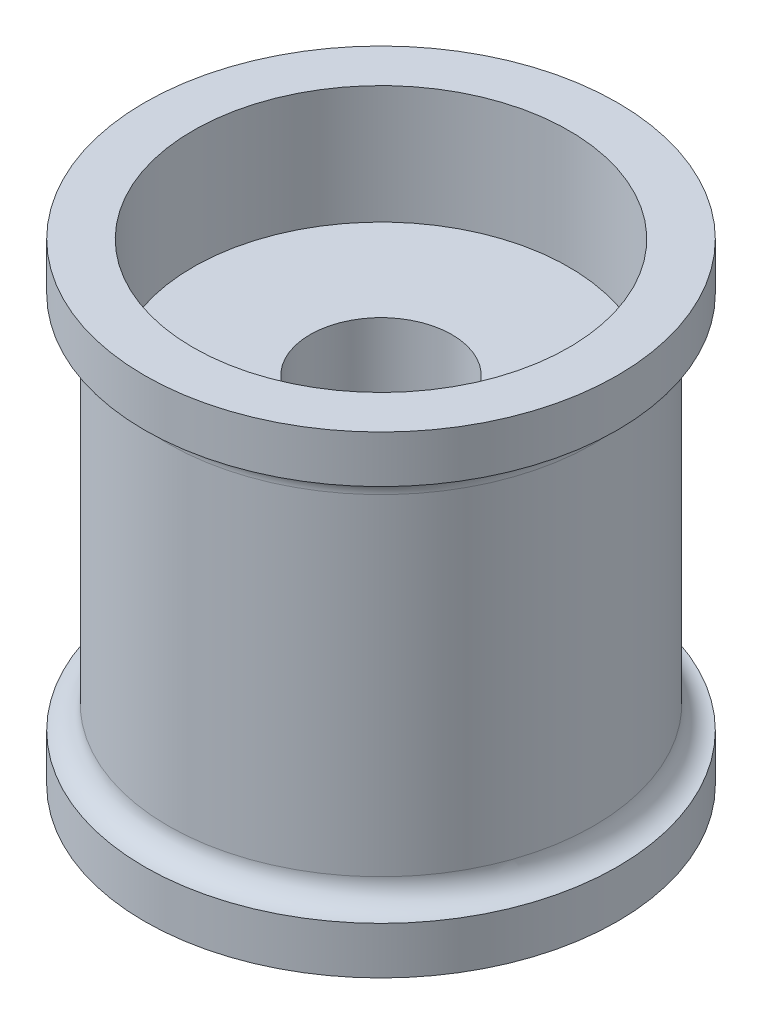
ISO-10303-21;
HEADER;
FILE_DESCRIPTION(('STEP AP214'),'2;1');
FILE_NAME('part.step','',(''),(''),'','','');
FILE_SCHEMA(('AUTOMOTIVE_DESIGN { 1 0 10303 214 1 1 1 1 }'));
ENDSEC;
DATA;
#1=APPLICATION_CONTEXT('core data for automotive mechanical design processes');
#2=APPLICATION_PROTOCOL_DEFINITION('international standard','automotive_design',2000,#1);
#3=PRODUCT_CONTEXT('',#1,'mechanical');
#4=PRODUCT('Part','Part','',(#3));
#5=PRODUCT_RELATED_PRODUCT_CATEGORY('part','',(#4));
#6=PRODUCT_DEFINITION_FORMATION('','',#4);
#7=PRODUCT_DEFINITION_CONTEXT('part definition',#1,'design');
#8=PRODUCT_DEFINITION('design','',#6,#7);
#9=PRODUCT_DEFINITION_SHAPE('','',#8);
#10=(LENGTH_UNIT() NAMED_UNIT(*) SI_UNIT(.MILLI.,.METRE.));
#11=(NAMED_UNIT(*) PLANE_ANGLE_UNIT() SI_UNIT($,.RADIAN.));
#12=(NAMED_UNIT(*) SI_UNIT($,.STERADIAN.) SOLID_ANGLE_UNIT());
#13=UNCERTAINTY_MEASURE_WITH_UNIT(LENGTH_MEASURE(1.E-05),#10,'distance_accuracy_value','');
#14=(GEOMETRIC_REPRESENTATION_CONTEXT(3) GLOBAL_UNCERTAINTY_ASSIGNED_CONTEXT((#13)) GLOBAL_UNIT_ASSIGNED_CONTEXT((#10,
#11,#12)) REPRESENTATION_CONTEXT('',''));
#15=CARTESIAN_POINT('',(0.,0.,0.));
#16=DIRECTION('',(0.,0.,1.));
#17=DIRECTION('',(1.,0.,0.));
#18=AXIS2_PLACEMENT_3D('',#15,#16,#17);
#19=CARTESIAN_POINT('',(0.,20.,0.));
#20=DIRECTION('',(0.,-1.,0.));
#21=DIRECTION('',(0.,0.,-1.));
#22=AXIS2_PLACEMENT_3D('',#19,#20,#21);
#23=CYLINDRICAL_SURFACE('',#22,3.);
#24=CARTESIAN_POINT('',(0.,5.,0.));
#25=DIRECTION('',(0.,-1.,0.));
#26=DIRECTION('',(0.,0.,-1.));
#27=AXIS2_PLACEMENT_3D('',#24,#25,#26);
#28=CIRCLE('',#27,3.);
#29=CARTESIAN_POINT('',(0.,5.,-3.));
#30=VERTEX_POINT('',#29);
#31=EDGE_CURVE('E61',#30,#30,#28,.T.);
#32=ORIENTED_EDGE('',*,*,#31,.T.);
#33=EDGE_LOOP('',(#32));
#34=FACE_BOUND('',#33,.T.);
#35=CARTESIAN_POINT('',(0.,15.,0.));
#36=DIRECTION('',(0.,1.,0.));
#37=DIRECTION('',(0.,0.,1.));
#38=AXIS2_PLACEMENT_3D('',#35,#36,#37);
#39=CIRCLE('',#38,3.);
#40=CARTESIAN_POINT('',(0.,15.,3.));
#41=VERTEX_POINT('',#40);
#42=EDGE_CURVE('E47',#41,#41,#39,.T.);
#43=ORIENTED_EDGE('',*,*,#42,.T.);
#44=EDGE_LOOP('',(#43));
#45=FACE_BOUND('',#44,.T.);
#46=ADVANCED_FACE('F43',(#34,#45),#23,.F.);
#47=CARTESIAN_POINT('',(0.,3.,0.));
#48=DIRECTION('',(0.,-1.,0.));
#49=DIRECTION('',(0.,0.,-1.));
#50=AXIS2_PLACEMENT_3D('',#47,#48,#49);
#51=TOROIDAL_SURFACE('',#50,10.,1.);
#52=CARTESIAN_POINT('',(0.,2.,0.));
#53=DIRECTION('',(0.,1.,0.));
#54=DIRECTION('',(0.,0.,1.));
#55=AXIS2_PLACEMENT_3D('',#52,#53,#54);
#56=CIRCLE('',#55,10.);
#57=CARTESIAN_POINT('',(0.,2.,10.));
#58=VERTEX_POINT('',#57);
#59=EDGE_CURVE('E71',#58,#58,#56,.T.);
#60=ORIENTED_EDGE('',*,*,#59,.T.);
#61=EDGE_LOOP('',(#60));
#62=FACE_BOUND('',#61,.T.);
#63=CARTESIAN_POINT('',(0.,3.,0.));
#64=DIRECTION('',(0.,-1.,0.));
#65=DIRECTION('',(0.,0.,-1.));
#66=AXIS2_PLACEMENT_3D('',#63,#64,#65);
#67=CIRCLE('',#66,9.);
#68=CARTESIAN_POINT('',(0.,3.,-9.));
#69=VERTEX_POINT('',#68);
#70=EDGE_CURVE('E10',#69,#69,#67,.F.);
#71=ORIENTED_EDGE('',*,*,#70,.F.);
#72=EDGE_LOOP('',(#71));
#73=FACE_BOUND('',#72,.T.);
#74=ADVANCED_FACE('F45',(#62,#73),#51,.F.);
#75=CARTESIAN_POINT('',(0.,17.,0.));
#76=DIRECTION('',(0.,1.,0.));
#77=DIRECTION('',(0.,0.,1.));
#78=AXIS2_PLACEMENT_3D('',#75,#76,#77);
#79=TOROIDAL_SURFACE('',#78,10.,1.);
#80=CARTESIAN_POINT('',(0.,18.,0.));
#81=DIRECTION('',(0.,1.,0.));
#82=DIRECTION('',(0.,0.,1.));
#83=AXIS2_PLACEMENT_3D('',#80,#81,#82);
#84=CIRCLE('',#83,10.);
#85=CARTESIAN_POINT('',(0.,18.,10.));
#86=VERTEX_POINT('',#85);
#87=EDGE_CURVE('E58',#86,#86,#84,.T.);
#88=ORIENTED_EDGE('',*,*,#87,.F.);
#89=EDGE_LOOP('',(#88));
#90=FACE_BOUND('',#89,.T.);
#91=CARTESIAN_POINT('',(0.,17.,0.));
#92=DIRECTION('',(0.,1.,0.));
#93=DIRECTION('',(0.,0.,1.));
#94=AXIS2_PLACEMENT_3D('',#91,#92,#93);
#95=CIRCLE('',#94,9.);
#96=CARTESIAN_POINT('',(0.,17.,9.));
#97=VERTEX_POINT('',#96);
#98=EDGE_CURVE('E52',#97,#97,#95,.F.);
#99=ORIENTED_EDGE('',*,*,#98,.F.);
#100=EDGE_LOOP('',(#99));
#101=FACE_BOUND('',#100,.T.);
#102=ADVANCED_FACE('F120',(#90,#101),#79,.F.);
#103=CARTESIAN_POINT('',(0.,0.,0.));
#104=DIRECTION('',(0.,1.,0.));
#105=DIRECTION('',(0.,0.,1.));
#106=AXIS2_PLACEMENT_3D('',#103,#104,#105);
#107=CYLINDRICAL_SURFACE('',#106,9.);
#108=ORIENTED_EDGE('',*,*,#70,.T.);
#109=EDGE_LOOP('',(#108));
#110=FACE_BOUND('',#109,.T.);
#111=ORIENTED_EDGE('',*,*,#98,.T.);
#112=EDGE_LOOP('',(#111));
#113=FACE_BOUND('',#112,.T.);
#114=ADVANCED_FACE('F124',(#110,#113),#107,.T.);
#115=CARTESIAN_POINT('',(0.,20.,0.));
#116=DIRECTION('',(0.,1.,0.));
#117=DIRECTION('',(0.,0.,1.));
#118=AXIS2_PLACEMENT_3D('',#115,#116,#117);
#119=PLANE('',#118);
#120=CARTESIAN_POINT('',(0.,20.,0.));
#121=DIRECTION('',(0.,1.,0.));
#122=DIRECTION('',(0.,0.,1.));
#123=AXIS2_PLACEMENT_3D('',#120,#121,#122);
#124=CIRCLE('',#123,7.95);
#125=CARTESIAN_POINT('',(0.,20.,7.95));
#126=VERTEX_POINT('',#125);
#127=EDGE_CURVE('E82',#126,#126,#124,.T.);
#128=ORIENTED_EDGE('',*,*,#127,.F.);
#129=EDGE_LOOP('',(#128));
#130=FACE_BOUND('',#129,.T.);
#131=CARTESIAN_POINT('',(0.,20.,0.));
#132=DIRECTION('',(0.,1.,0.));
#133=DIRECTION('',(0.,0.,1.));
#134=AXIS2_PLACEMENT_3D('',#131,#132,#133);
#135=CIRCLE('',#134,10.);
#136=CARTESIAN_POINT('',(0.,20.,10.));
#137=VERTEX_POINT('',#136);
#138=EDGE_CURVE('E87',#137,#137,#135,.T.);
#139=ORIENTED_EDGE('',*,*,#138,.T.);
#140=EDGE_LOOP('',(#139));
#141=FACE_BOUND('',#140,.T.);
#142=ADVANCED_FACE('F95',(#130,#141),#119,.T.);
#143=CARTESIAN_POINT('',(0.,0.,0.));
#144=DIRECTION('',(0.,1.,0.));
#145=DIRECTION('',(0.,0.,1.));
#146=AXIS2_PLACEMENT_3D('',#143,#144,#145);
#147=PLANE('',#146);
#148=CARTESIAN_POINT('',(0.,0.,0.));
#149=DIRECTION('',(0.,-1.,0.));
#150=DIRECTION('',(0.,0.,-1.));
#151=AXIS2_PLACEMENT_3D('',#148,#149,#150);
#152=CIRCLE('',#151,7.95);
#153=CARTESIAN_POINT('',(0.,0.,-7.95));
#154=VERTEX_POINT('',#153);
#155=EDGE_CURVE('E74',#154,#154,#152,.T.);
#156=ORIENTED_EDGE('',*,*,#155,.F.);
#157=EDGE_LOOP('',(#156));
#158=FACE_BOUND('',#157,.T.);
#159=CARTESIAN_POINT('',(0.,0.,0.));
#160=DIRECTION('',(0.,1.,0.));
#161=DIRECTION('',(0.,0.,1.));
#162=AXIS2_PLACEMENT_3D('',#159,#160,#161);
#163=CIRCLE('',#162,10.);
#164=CARTESIAN_POINT('',(0.,0.,10.));
#165=VERTEX_POINT('',#164);
#166=EDGE_CURVE('E64',#165,#165,#163,.T.);
#167=ORIENTED_EDGE('',*,*,#166,.F.);
#168=EDGE_LOOP('',(#167));
#169=FACE_BOUND('',#168,.T.);
#170=ADVANCED_FACE('F100',(#158,#169),#147,.F.);
#171=CARTESIAN_POINT('',(0.,18.,0.));
#172=DIRECTION('',(0.,1.,0.));
#173=DIRECTION('',(0.,0.,1.));
#174=AXIS2_PLACEMENT_3D('',#171,#172,#173);
#175=CYLINDRICAL_SURFACE('',#174,10.);
#176=ORIENTED_EDGE('',*,*,#87,.T.);
#177=EDGE_LOOP('',(#176));
#178=FACE_BOUND('',#177,.T.);
#179=ORIENTED_EDGE('',*,*,#138,.F.);
#180=EDGE_LOOP('',(#179));
#181=FACE_BOUND('',#180,.T.);
#182=ADVANCED_FACE('F97',(#178,#181),#175,.T.);
#183=CARTESIAN_POINT('',(0.,2.,0.));
#184=DIRECTION('',(0.,-1.,0.));
#185=DIRECTION('',(0.,0.,-1.));
#186=AXIS2_PLACEMENT_3D('',#183,#184,#185);
#187=CYLINDRICAL_SURFACE('',#186,10.);
#188=ORIENTED_EDGE('',*,*,#59,.F.);
#189=EDGE_LOOP('',(#188));
#190=FACE_BOUND('',#189,.T.);
#191=ORIENTED_EDGE('',*,*,#166,.T.);
#192=EDGE_LOOP('',(#191));
#193=FACE_BOUND('',#192,.T.);
#194=ADVANCED_FACE('F99',(#190,#193),#187,.T.);
#195=CARTESIAN_POINT('',(0.,5.,0.));
#196=DIRECTION('',(0.,-1.,0.));
#197=DIRECTION('',(0.,0.,-1.));
#198=AXIS2_PLACEMENT_3D('',#195,#196,#197);
#199=CYLINDRICAL_SURFACE('',#198,7.95);
#200=CARTESIAN_POINT('',(0.,5.,0.));
#201=DIRECTION('',(0.,-1.,0.));
#202=DIRECTION('',(0.,0.,-1.));
#203=AXIS2_PLACEMENT_3D('',#200,#201,#202);
#204=CIRCLE('',#203,7.95);
#205=CARTESIAN_POINT('',(0.,5.,-7.95));
#206=VERTEX_POINT('',#205);
#207=EDGE_CURVE('E65',#206,#206,#204,.T.);
#208=ORIENTED_EDGE('',*,*,#207,.F.);
#209=EDGE_LOOP('',(#208));
#210=FACE_BOUND('',#209,.T.);
#211=ORIENTED_EDGE('',*,*,#155,.T.);
#212=EDGE_LOOP('',(#211));
#213=FACE_BOUND('',#212,.T.);
#214=ADVANCED_FACE('F106',(#210,#213),#199,.F.);
#215=CARTESIAN_POINT('',(0.,5.,0.));
#216=DIRECTION('',(0.,-1.,0.));
#217=DIRECTION('',(0.,0.,-1.));
#218=AXIS2_PLACEMENT_3D('',#215,#216,#217);
#219=PLANE('',#218);
#220=ORIENTED_EDGE('',*,*,#31,.F.);
#221=EDGE_LOOP('',(#220));
#222=FACE_BOUND('',#221,.T.);
#223=ORIENTED_EDGE('',*,*,#207,.T.);
#224=EDGE_LOOP('',(#223));
#225=FACE_BOUND('',#224,.T.);
#226=ADVANCED_FACE('F151',(#222,#225),#219,.T.);
#227=CARTESIAN_POINT('',(0.,15.,0.));
#228=DIRECTION('',(0.,1.,0.));
#229=DIRECTION('',(0.,0.,1.));
#230=AXIS2_PLACEMENT_3D('',#227,#228,#229);
#231=CYLINDRICAL_SURFACE('',#230,7.95);
#232=CARTESIAN_POINT('',(0.,15.,0.));
#233=DIRECTION('',(0.,1.,0.));
#234=DIRECTION('',(0.,0.,1.));
#235=AXIS2_PLACEMENT_3D('',#232,#233,#234);
#236=CIRCLE('',#235,7.95);
#237=CARTESIAN_POINT('',(0.,15.,7.95));
#238=VERTEX_POINT('',#237);
#239=EDGE_CURVE('E194',#238,#238,#236,.T.);
#240=ORIENTED_EDGE('',*,*,#239,.F.);
#241=EDGE_LOOP('',(#240));
#242=FACE_BOUND('',#241,.T.);
#243=ORIENTED_EDGE('',*,*,#127,.T.);
#244=EDGE_LOOP('',(#243));
#245=FACE_BOUND('',#244,.T.);
#246=ADVANCED_FACE('F159',(#242,#245),#231,.F.);
#247=CARTESIAN_POINT('',(0.,15.,0.));
#248=DIRECTION('',(0.,1.,0.));
#249=DIRECTION('',(0.,0.,1.));
#250=AXIS2_PLACEMENT_3D('',#247,#248,#249);
#251=PLANE('',#250);
#252=ORIENTED_EDGE('',*,*,#42,.F.);
#253=EDGE_LOOP('',(#252));
#254=FACE_BOUND('',#253,.T.);
#255=ORIENTED_EDGE('',*,*,#239,.T.);
#256=EDGE_LOOP('',(#255));
#257=FACE_BOUND('',#256,.T.);
#258=ADVANCED_FACE('F176',(#254,#257),#251,.T.);
#259=CLOSED_SHELL('',(#46,#74,#102,#114,#142,#170,#182,#194,#214,#226,#246,#258));
#260=MANIFOLD_SOLID_BREP('B2',#259);
#261=ADVANCED_BREP_SHAPE_REPRESENTATION('',(#18,#260),#14);
#262=SHAPE_DEFINITION_REPRESENTATION(#9,#261);
ENDSEC;
END-ISO-10303-21;
